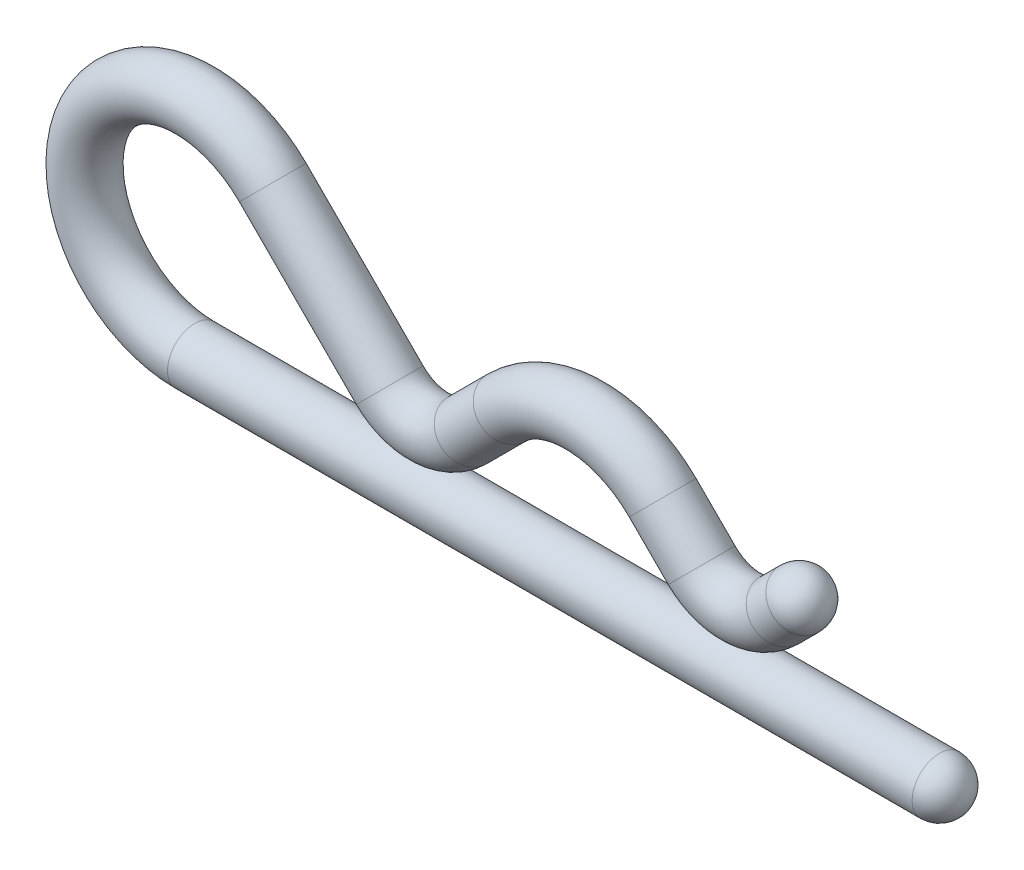
ISO-10303-21;
HEADER;
FILE_DESCRIPTION(('STEP AP214'),'2;1');
FILE_NAME('part.step','',(''),(''),'','','');
FILE_SCHEMA(('AUTOMOTIVE_DESIGN { 1 0 10303 214 1 1 1 1 }'));
ENDSEC;
DATA;
#1=APPLICATION_CONTEXT('core data for automotive mechanical design processes');
#2=APPLICATION_PROTOCOL_DEFINITION('international standard','automotive_design',2000,#1);
#3=PRODUCT_CONTEXT('',#1,'mechanical');
#4=PRODUCT('Part','Part','',(#3));
#5=PRODUCT_RELATED_PRODUCT_CATEGORY('part','',(#4));
#6=PRODUCT_DEFINITION_FORMATION('','',#4);
#7=PRODUCT_DEFINITION_CONTEXT('part definition',#1,'design');
#8=PRODUCT_DEFINITION('design','',#6,#7);
#9=PRODUCT_DEFINITION_SHAPE('','',#8);
#10=(LENGTH_UNIT() NAMED_UNIT(*) SI_UNIT(.MILLI.,.METRE.));
#11=(NAMED_UNIT(*) PLANE_ANGLE_UNIT() SI_UNIT($,.RADIAN.));
#12=(NAMED_UNIT(*) SI_UNIT($,.STERADIAN.) SOLID_ANGLE_UNIT());
#13=UNCERTAINTY_MEASURE_WITH_UNIT(LENGTH_MEASURE(1.E-05),#10,'distance_accuracy_value','');
#14=(GEOMETRIC_REPRESENTATION_CONTEXT(3) GLOBAL_UNCERTAINTY_ASSIGNED_CONTEXT((#13)) GLOBAL_UNIT_ASSIGNED_CONTEXT((#10,
#11,#12)) REPRESENTATION_CONTEXT('',''));
#15=CARTESIAN_POINT('',(0.,0.,0.));
#16=DIRECTION('',(0.,0.,1.));
#17=DIRECTION('',(1.,0.,0.));
#18=AXIS2_PLACEMENT_3D('',#15,#16,#17);
#19=CARTESIAN_POINT('',(0.,0.,0.));
#20=DIRECTION('',(-1.,0.,0.));
#21=DIRECTION('',(0.,-1.,0.));
#22=AXIS2_PLACEMENT_3D('',#19,#20,#21);
#23=CYLINDRICAL_SURFACE('',#22,0.99);
#24=CARTESIAN_POINT('',(-0.99,0.,0.));
#25=DIRECTION('',(-1.,0.,0.));
#26=DIRECTION('',(0.,-1.,0.));
#27=AXIS2_PLACEMENT_3D('',#24,#25,#26);
#28=CIRCLE('',#27,0.99);
#29=CARTESIAN_POINT('',(-0.99,-0.99,0.));
#30=VERTEX_POINT('',#29);
#31=EDGE_CURVE('E45',#30,#30,#28,.T.);
#32=ORIENTED_EDGE('',*,*,#31,.T.);
#33=EDGE_LOOP('',(#32));
#34=FACE_BOUND('',#33,.T.);
#35=CARTESIAN_POINT('',(-28.,0.,0.));
#36=DIRECTION('',(1.,0.,0.));
#37=DIRECTION('',(0.,0.,-1.));
#38=AXIS2_PLACEMENT_3D('',#35,#36,#37);
#39=CIRCLE('',#38,0.99);
#40=CARTESIAN_POINT('',(-28.,-0.990000000000001,0.));
#41=VERTEX_POINT('',#40);
#42=EDGE_CURVE('E81',#41,#41,#39,.T.);
#43=ORIENTED_EDGE('',*,*,#42,.T.);
#44=EDGE_LOOP('',(#43));
#45=FACE_BOUND('',#44,.T.);
#46=ADVANCED_FACE('F37',(#34,#45),#23,.T.);
#47=CARTESIAN_POINT('',(-28.,4.,0.));
#48=DIRECTION('',(0.,0.,-1.));
#49=DIRECTION('',(-1.,0.,0.));
#50=AXIS2_PLACEMENT_3D('',#47,#48,#49);
#51=TOROIDAL_SURFACE('',#50,4.,0.99);
#52=CARTESIAN_POINT('',(-25.1715728752538,6.8284271247462,0.));
#53=DIRECTION('',(-0.707106781186551,0.707106781186545,0.));
#54=DIRECTION('',(0.,0.,-1.));
#55=AXIS2_PLACEMENT_3D('',#52,#53,#54);
#56=CIRCLE('',#55,0.99);
#57=CARTESIAN_POINT('',(-24.4715371618791,7.52846283812088,0.));
#58=VERTEX_POINT('',#57);
#59=EDGE_CURVE('E77',#58,#58,#56,.T.);
#60=CARTESIAN_POINT('',(-28.,4.,0.));
#61=DIRECTION('',(0.,0.,-1.));
#62=DIRECTION('',(-1.,0.,0.));
#63=AXIS2_PLACEMENT_3D('',#60,#61,#62);
#64=CIRCLE('',#63,4.99);
#65=EDGE_CURVE('',#41,#58,#64,.T.);
#66=ORIENTED_EDGE('',*,*,#42,.F.);
#67=ORIENTED_EDGE('',*,*,#59,.T.);
#68=ORIENTED_EDGE('',*,*,#65,.T.);
#69=ORIENTED_EDGE('',*,*,#65,.F.);
#70=EDGE_LOOP('',(#66,#68,#67,#69));
#71=FACE_BOUND('',#70,.T.);
#72=ADVANCED_FACE('F87',(#71),#51,.T.);
#73=CARTESIAN_POINT('',(-25.1715728752538,6.8284271247462,0.));
#74=DIRECTION('',(0.707106781186551,-0.707106781186544,0.));
#75=DIRECTION('',(0.707106781186544,0.707106781186551,0.));
#76=AXIS2_PLACEMENT_3D('',#73,#74,#75);
#77=CYLINDRICAL_SURFACE('',#76,0.99);
#78=CARTESIAN_POINT('',(-20.9289321881345,2.58578643762689,0.));
#79=DIRECTION('',(-0.707106781186551,0.707106781186544,0.));
#80=DIRECTION('',(0.,0.,-1.));
#81=AXIS2_PLACEMENT_3D('',#78,#79,#80);
#82=CIRCLE('',#81,0.99);
#83=CARTESIAN_POINT('',(-21.6289679015092,1.88575072425221,0.));
#84=VERTEX_POINT('',#83);
#85=EDGE_CURVE('E73',#84,#84,#82,.T.);
#86=ORIENTED_EDGE('',*,*,#85,.T.);
#87=EDGE_LOOP('',(#86));
#88=FACE_BOUND('',#87,.T.);
#89=ORIENTED_EDGE('',*,*,#59,.F.);
#90=EDGE_LOOP('',(#89));
#91=FACE_BOUND('',#90,.T.);
#92=ADVANCED_FACE('F89',(#88,#91),#77,.T.);
#93=CARTESIAN_POINT('',(-19.5147186257614,4.,0.));
#94=DIRECTION('',(0.,0.,1.));
#95=DIRECTION('',(1.,0.,0.));
#96=AXIS2_PLACEMENT_3D('',#93,#94,#95);
#97=TOROIDAL_SURFACE('',#96,2.,0.99);
#98=CARTESIAN_POINT('',(-18.1005050633883,2.5857864376269,0.));
#99=DIRECTION('',(-0.70710678118655,-0.707106781186545,0.));
#100=DIRECTION('',(0.,0.,-1.));
#101=AXIS2_PLACEMENT_3D('',#98,#99,#100);
#102=CIRCLE('',#101,0.99);
#103=CARTESIAN_POINT('',(-17.4004693500136,1.88575072425221,0.));
#104=VERTEX_POINT('',#103);
#105=EDGE_CURVE('E69',#104,#104,#102,.T.);
#106=CARTESIAN_POINT('',(-19.5147186257614,4.,0.));
#107=DIRECTION('',(0.,0.,1.));
#108=DIRECTION('',(1.,0.,0.));
#109=AXIS2_PLACEMENT_3D('',#106,#107,#108);
#110=CIRCLE('',#109,2.99);
#111=EDGE_CURVE('',#84,#104,#110,.T.);
#112=ORIENTED_EDGE('',*,*,#85,.F.);
#113=ORIENTED_EDGE('',*,*,#105,.T.);
#114=ORIENTED_EDGE('',*,*,#111,.T.);
#115=ORIENTED_EDGE('',*,*,#111,.F.);
#116=EDGE_LOOP('',(#112,#114,#113,#115));
#117=FACE_BOUND('',#116,.T.);
#118=ADVANCED_FACE('F96',(#117),#97,.T.);
#119=CARTESIAN_POINT('',(-18.1005050633883,2.58578643762689,0.));
#120=DIRECTION('',(0.707106781186551,0.707106781186544,0.));
#121=DIRECTION('',(-0.707106781186544,0.707106781186551,0.));
#122=AXIS2_PLACEMENT_3D('',#119,#120,#121);
#123=CYLINDRICAL_SURFACE('',#122,0.99);
#124=CARTESIAN_POINT('',(-16.6862915010152,3.99999999999998,0.));
#125=DIRECTION('',(-0.707106781186551,-0.707106781186544,0.));
#126=DIRECTION('',(0.,0.,-1.));
#127=AXIS2_PLACEMENT_3D('',#124,#125,#126);
#128=CIRCLE('',#127,0.99);
#129=CARTESIAN_POINT('',(-17.3863272143899,4.70003571337467,0.));
#130=VERTEX_POINT('',#129);
#131=EDGE_CURVE('E65',#130,#130,#128,.T.);
#132=ORIENTED_EDGE('',*,*,#131,.T.);
#133=EDGE_LOOP('',(#132));
#134=FACE_BOUND('',#133,.T.);
#135=ORIENTED_EDGE('',*,*,#105,.F.);
#136=EDGE_LOOP('',(#135));
#137=FACE_BOUND('',#136,.T.);
#138=ADVANCED_FACE('F121',(#134,#137),#123,.T.);
#139=CARTESIAN_POINT('',(-13.857864376269,1.17157287525378,0.));
#140=DIRECTION('',(0.,0.,-1.));
#141=DIRECTION('',(-1.,0.,0.));
#142=AXIS2_PLACEMENT_3D('',#139,#140,#141);
#143=TOROIDAL_SURFACE('',#142,4.,0.99);
#144=CARTESIAN_POINT('',(-11.0294372515228,3.99999999999998,0.));
#145=DIRECTION('',(-0.707106781186551,0.707106781186544,0.));
#146=DIRECTION('',(0.,0.,-1.));
#147=AXIS2_PLACEMENT_3D('',#144,#145,#146);
#148=CIRCLE('',#147,0.99);
#149=CARTESIAN_POINT('',(-10.3294015381482,4.70003571337467,0.));
#150=VERTEX_POINT('',#149);
#151=EDGE_CURVE('E61',#150,#150,#148,.T.);
#152=CARTESIAN_POINT('',(-13.857864376269,1.17157287525378,0.));
#153=DIRECTION('',(0.,0.,-1.));
#154=DIRECTION('',(-1.,0.,0.));
#155=AXIS2_PLACEMENT_3D('',#152,#153,#154);
#156=CIRCLE('',#155,4.99);
#157=EDGE_CURVE('',#130,#150,#156,.T.);
#158=ORIENTED_EDGE('',*,*,#131,.F.);
#159=ORIENTED_EDGE('',*,*,#151,.T.);
#160=ORIENTED_EDGE('',*,*,#157,.T.);
#161=ORIENTED_EDGE('',*,*,#157,.F.);
#162=EDGE_LOOP('',(#158,#160,#159,#161));
#163=FACE_BOUND('',#162,.T.);
#164=ADVANCED_FACE('F117',(#163),#143,.T.);
#165=CARTESIAN_POINT('',(-11.0294372515228,3.99999999999998,0.));
#166=DIRECTION('',(0.707106781186552,-0.707106781186543,0.));
#167=DIRECTION('',(0.707106781186543,0.707106781186552,0.));
#168=AXIS2_PLACEMENT_3D('',#165,#166,#167);
#169=CYLINDRICAL_SURFACE('',#168,0.99);
#170=CARTESIAN_POINT('',(-9.61522368914975,2.58578643762689,0.));
#171=DIRECTION('',(-0.707106781186552,0.707106781186543,0.));
#172=DIRECTION('',(0.,0.,-1.));
#173=AXIS2_PLACEMENT_3D('',#170,#171,#172);
#174=CIRCLE('',#173,0.99);
#175=CARTESIAN_POINT('',(-10.3152594025244,1.88575072425221,0.));
#176=VERTEX_POINT('',#175);
#177=EDGE_CURVE('E55',#176,#176,#174,.T.);
#178=ORIENTED_EDGE('',*,*,#177,.T.);
#179=EDGE_LOOP('',(#178));
#180=FACE_BOUND('',#179,.T.);
#181=ORIENTED_EDGE('',*,*,#151,.F.);
#182=EDGE_LOOP('',(#181));
#183=FACE_BOUND('',#182,.T.);
#184=ADVANCED_FACE('F110',(#180,#183),#169,.T.);
#185=CARTESIAN_POINT('',(-8.20101012677666,4.,0.));
#186=DIRECTION('',(0.,0.,1.));
#187=DIRECTION('',(1.,0.,0.));
#188=AXIS2_PLACEMENT_3D('',#185,#186,#187);
#189=TOROIDAL_SURFACE('',#188,2.,0.99);
#190=CARTESIAN_POINT('',(-6.78679656440357,2.5857864376269,0.));
#191=DIRECTION('',(-0.707106781186551,-0.707106781186544,0.));
#192=DIRECTION('',(0.,0.,-1.));
#193=AXIS2_PLACEMENT_3D('',#190,#191,#192);
#194=CIRCLE('',#193,0.99);
#195=CARTESIAN_POINT('',(-6.08676085102889,1.88575072425221,0.));
#196=VERTEX_POINT('',#195);
#197=EDGE_CURVE('E50',#196,#196,#194,.T.);
#198=CARTESIAN_POINT('',(-8.20101012677666,4.,0.));
#199=DIRECTION('',(0.,0.,1.));
#200=DIRECTION('',(1.,0.,0.));
#201=AXIS2_PLACEMENT_3D('',#198,#199,#200);
#202=CIRCLE('',#201,2.99);
#203=EDGE_CURVE('',#176,#196,#202,.T.);
#204=ORIENTED_EDGE('',*,*,#177,.F.);
#205=ORIENTED_EDGE('',*,*,#197,.T.);
#206=ORIENTED_EDGE('',*,*,#203,.T.);
#207=ORIENTED_EDGE('',*,*,#203,.F.);
#208=EDGE_LOOP('',(#204,#206,#205,#207));
#209=FACE_BOUND('',#208,.T.);
#210=ADVANCED_FACE('F103',(#209),#189,.T.);
#211=CARTESIAN_POINT('',(-6.78679656440357,2.58578643762689,0.));
#212=DIRECTION('',(0.707106781186551,0.707106781186544,0.));
#213=DIRECTION('',(-0.707106781186544,0.707106781186551,0.));
#214=AXIS2_PLACEMENT_3D('',#211,#212,#213);
#215=CYLINDRICAL_SURFACE('',#214,0.99);
#216=CARTESIAN_POINT('',(-6.07261871540515,3.2999642866253,0.));
#217=DIRECTION('',(0.707106781186551,0.707106781186544,0.));
#218=DIRECTION('',(-0.707106781186544,0.707106781186551,0.));
#219=AXIS2_PLACEMENT_3D('',#216,#217,#218);
#220=CIRCLE('',#219,0.99);
#221=CARTESIAN_POINT('',(-6.77265442877983,3.99999999999999,0.));
#222=VERTEX_POINT('',#221);
#223=EDGE_CURVE('E10',#222,#222,#220,.F.);
#224=ORIENTED_EDGE('',*,*,#223,.T.);
#225=EDGE_LOOP('',(#224));
#226=FACE_BOUND('',#225,.T.);
#227=ORIENTED_EDGE('',*,*,#197,.F.);
#228=EDGE_LOOP('',(#227));
#229=FACE_BOUND('',#228,.T.);
#230=ADVANCED_FACE('F101',(#226,#229),#215,.T.);
#231=CARTESIAN_POINT('',(-0.99,0.,0.));
#232=DIRECTION('',(1.,0.,0.));
#233=DIRECTION('',(0.,0.,-1.));
#234=AXIS2_PLACEMENT_3D('',#231,#232,#233);
#235=SPHERICAL_SURFACE('',#234,0.99);
#236=ORIENTED_EDGE('',*,*,#31,.F.);
#237=EDGE_LOOP('',(#236));
#238=FACE_BOUND('',#237,.T.);
#239=ADVANCED_FACE('F100',(#238),#235,.T.);
#240=CARTESIAN_POINT('',(-6.07261871540515,3.2999642866253,0.));
#241=DIRECTION('',(-0.707106781186551,-0.707106781186544,0.));
#242=DIRECTION('',(0.707106781186544,-0.707106781186551,0.));
#243=AXIS2_PLACEMENT_3D('',#240,#241,#242);
#244=SPHERICAL_SURFACE('',#243,0.99);
#245=ORIENTED_EDGE('',*,*,#223,.F.);
#246=EDGE_LOOP('',(#245));
#247=FACE_BOUND('',#246,.T.);
#248=ADVANCED_FACE('F39',(#247),#244,.T.);
#249=CLOSED_SHELL('',(#46,#72,#92,#118,#138,#164,#184,#210,#230,#239,#248));
#250=MANIFOLD_SOLID_BREP('B2',#249);
#251=ADVANCED_BREP_SHAPE_REPRESENTATION('',(#18,#250),#14);
#252=SHAPE_DEFINITION_REPRESENTATION(#9,#251);
ENDSEC;
END-ISO-10303-21;
